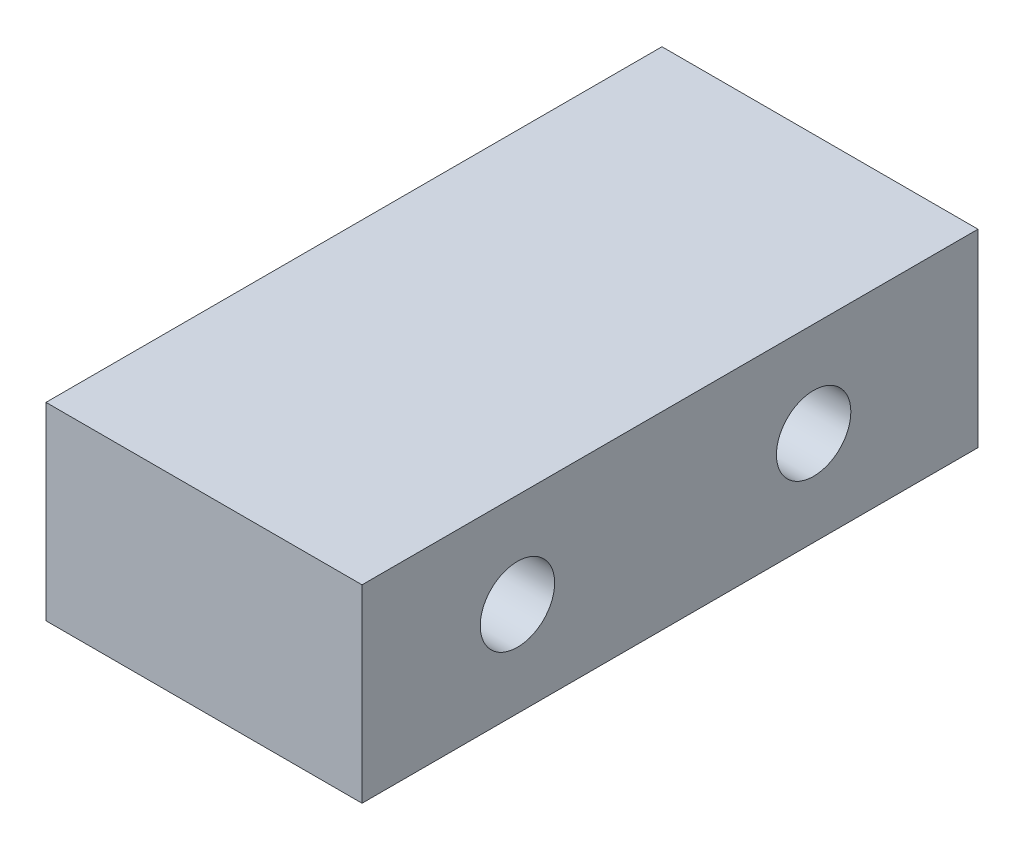
ISO-10303-21;
HEADER;
FILE_DESCRIPTION(('STEP AP214'),'2;1');
FILE_NAME('part.step','',(''),(''),'','','');
FILE_SCHEMA(('AUTOMOTIVE_DESIGN { 1 0 10303 214 1 1 1 1 }'));
ENDSEC;
DATA;
#1=APPLICATION_CONTEXT('core data for automotive mechanical design processes');
#2=APPLICATION_PROTOCOL_DEFINITION('international standard','automotive_design',2000,#1);
#3=PRODUCT_CONTEXT('',#1,'mechanical');
#4=PRODUCT('Part','Part','',(#3));
#5=PRODUCT_RELATED_PRODUCT_CATEGORY('part','',(#4));
#6=PRODUCT_DEFINITION_FORMATION('','',#4);
#7=PRODUCT_DEFINITION_CONTEXT('part definition',#1,'design');
#8=PRODUCT_DEFINITION('design','',#6,#7);
#9=PRODUCT_DEFINITION_SHAPE('','',#8);
#10=(LENGTH_UNIT() NAMED_UNIT(*) SI_UNIT(.MILLI.,.METRE.));
#11=(NAMED_UNIT(*) PLANE_ANGLE_UNIT() SI_UNIT($,.RADIAN.));
#12=(NAMED_UNIT(*) SI_UNIT($,.STERADIAN.) SOLID_ANGLE_UNIT());
#13=UNCERTAINTY_MEASURE_WITH_UNIT(LENGTH_MEASURE(1.E-05),#10,'distance_accuracy_value','');
#14=(GEOMETRIC_REPRESENTATION_CONTEXT(3) GLOBAL_UNCERTAINTY_ASSIGNED_CONTEXT((#13)) GLOBAL_UNIT_ASSIGNED_CONTEXT((#10,
#11,#12)) REPRESENTATION_CONTEXT('',''));
#15=CARTESIAN_POINT('',(0.,0.,0.));
#16=DIRECTION('',(0.,0.,1.));
#17=DIRECTION('',(1.,0.,0.));
#18=AXIS2_PLACEMENT_3D('',#15,#16,#17);
#19=CARTESIAN_POINT('',(5.095,6.1,9.93));
#20=DIRECTION('',(-1.,0.,0.));
#21=DIRECTION('',(0.,0.,1.));
#22=AXIS2_PLACEMENT_3D('',#19,#20,#21);
#23=PLANE('',#22);
#24=CARTESIAN_POINT('',(5.095,3.05,4.92));
#25=DIRECTION('',(1.,0.,0.));
#26=DIRECTION('',(0.,0.,-1.));
#27=AXIS2_PLACEMENT_3D('',#24,#25,#26);
#28=CIRCLE('',#27,1.2);
#29=CARTESIAN_POINT('',(5.095,3.05,3.72));
#30=VERTEX_POINT('',#29);
#31=EDGE_CURVE('E115',#30,#30,#28,.T.);
#32=ORIENTED_EDGE('',*,*,#31,.F.);
#33=EDGE_LOOP('',(#32));
#34=FACE_BOUND('',#33,.T.);
#35=CARTESIAN_POINT('',(5.095,3.05,-4.63));
#36=DIRECTION('',(1.,0.,0.));
#37=DIRECTION('',(0.,0.,-1.));
#38=AXIS2_PLACEMENT_3D('',#35,#36,#37);
#39=CIRCLE('',#38,1.2);
#40=CARTESIAN_POINT('',(5.095,3.05,-5.83000000000001));
#41=VERTEX_POINT('',#40);
#42=EDGE_CURVE('E109',#41,#41,#39,.T.);
#43=ORIENTED_EDGE('',*,*,#42,.F.);
#44=EDGE_LOOP('',(#43));
#45=FACE_BOUND('',#44,.T.);
#46=DIRECTION('',(0.,0.,-1.));
#47=VECTOR('',#46,1.);
#48=CARTESIAN_POINT('',(5.095,0.,9.93));
#49=LINE('',#48,#47);
#50=CARTESIAN_POINT('',(5.095,0.,9.93));
#51=VERTEX_POINT('',#50);
#52=CARTESIAN_POINT('',(5.095,0.,-9.93000000000001));
#53=VERTEX_POINT('',#52);
#54=EDGE_CURVE('E95',#51,#53,#49,.T.);
#55=ORIENTED_EDGE('',*,*,#54,.T.);
#56=DIRECTION('',(0.,-1.,0.));
#57=VECTOR('',#56,1.);
#58=CARTESIAN_POINT('',(5.095,6.1,-9.93000000000001));
#59=LINE('',#58,#57);
#60=CARTESIAN_POINT('',(5.095,6.1,-9.93000000000001));
#61=VERTEX_POINT('',#60);
#62=EDGE_CURVE('E11',#61,#53,#59,.T.);
#63=ORIENTED_EDGE('',*,*,#62,.F.);
#64=DIRECTION('',(0.,0.,-1.));
#65=VECTOR('',#64,1.);
#66=CARTESIAN_POINT('',(5.095,6.1,9.93));
#67=LINE('',#66,#65);
#68=CARTESIAN_POINT('',(5.095,6.1,9.93));
#69=VERTEX_POINT('',#68);
#70=EDGE_CURVE('E83',#69,#61,#67,.T.);
#71=ORIENTED_EDGE('',*,*,#70,.F.);
#72=DIRECTION('',(0.,-1.,0.));
#73=VECTOR('',#72,1.);
#74=CARTESIAN_POINT('',(5.095,6.1,9.93));
#75=LINE('',#74,#73);
#76=EDGE_CURVE('E91',#69,#51,#75,.T.);
#77=ORIENTED_EDGE('',*,*,#76,.T.);
#78=EDGE_LOOP('',(#55,#63,#71,#77));
#79=FACE_BOUND('',#78,.T.);
#80=ADVANCED_FACE('F32',(#34,#45,#79),#23,.F.);
#81=CARTESIAN_POINT('',(-5.095,6.1,-9.93000000000001));
#82=DIRECTION('',(0.,0.,1.));
#83=DIRECTION('',(1.,0.,0.));
#84=AXIS2_PLACEMENT_3D('',#81,#82,#83);
#85=PLANE('',#84);
#86=DIRECTION('',(-1.,0.,0.));
#87=VECTOR('',#86,1.);
#88=CARTESIAN_POINT('',(-5.095,0.,-9.93000000000001));
#89=LINE('',#88,#87);
#90=CARTESIAN_POINT('',(-5.095,0.,-9.93000000000001));
#91=VERTEX_POINT('',#90);
#92=EDGE_CURVE('E87',#53,#91,#89,.T.);
#93=ORIENTED_EDGE('',*,*,#92,.T.);
#94=DIRECTION('',(0.,-1.,0.));
#95=VECTOR('',#94,1.);
#96=CARTESIAN_POINT('',(-5.095,6.1,-9.93000000000001));
#97=LINE('',#96,#95);
#98=CARTESIAN_POINT('',(-5.095,6.1,-9.93000000000001));
#99=VERTEX_POINT('',#98);
#100=EDGE_CURVE('E40',#99,#91,#97,.T.);
#101=ORIENTED_EDGE('',*,*,#100,.F.);
#102=DIRECTION('',(-1.,0.,0.));
#103=VECTOR('',#102,1.);
#104=CARTESIAN_POINT('',(-5.095,6.1,-9.93000000000001));
#105=LINE('',#104,#103);
#106=EDGE_CURVE('E78',#61,#99,#105,.T.);
#107=ORIENTED_EDGE('',*,*,#106,.F.);
#108=ORIENTED_EDGE('',*,*,#62,.T.);
#109=EDGE_LOOP('',(#93,#101,#107,#108));
#110=FACE_BOUND('',#109,.T.);
#111=ADVANCED_FACE('F86',(#110),#85,.F.);
#112=CARTESIAN_POINT('',(-5.095,6.1,9.93));
#113=DIRECTION('',(1.,0.,0.));
#114=DIRECTION('',(0.,0.,-1.));
#115=AXIS2_PLACEMENT_3D('',#112,#113,#114);
#116=PLANE('',#115);
#117=CARTESIAN_POINT('',(-5.095,3.05,4.92));
#118=DIRECTION('',(1.,0.,0.));
#119=DIRECTION('',(0.,0.,-1.));
#120=AXIS2_PLACEMENT_3D('',#117,#118,#119);
#121=CIRCLE('',#120,1.2);
#122=CARTESIAN_POINT('',(-5.095,3.05,3.72));
#123=VERTEX_POINT('',#122);
#124=EDGE_CURVE('E112',#123,#123,#121,.T.);
#125=ORIENTED_EDGE('',*,*,#124,.T.);
#126=EDGE_LOOP('',(#125));
#127=FACE_BOUND('',#126,.T.);
#128=CARTESIAN_POINT('',(-5.095,3.05,-4.63));
#129=DIRECTION('',(1.,0.,0.));
#130=DIRECTION('',(0.,0.,-1.));
#131=AXIS2_PLACEMENT_3D('',#128,#129,#130);
#132=CIRCLE('',#131,1.2);
#133=CARTESIAN_POINT('',(-5.095,3.05,-5.83000000000001));
#134=VERTEX_POINT('',#133);
#135=EDGE_CURVE('E98',#134,#134,#132,.T.);
#136=ORIENTED_EDGE('',*,*,#135,.T.);
#137=EDGE_LOOP('',(#136));
#138=FACE_BOUND('',#137,.T.);
#139=DIRECTION('',(0.,0.,1.));
#140=VECTOR('',#139,1.);
#141=CARTESIAN_POINT('',(-5.095,0.,9.93));
#142=LINE('',#141,#140);
#143=CARTESIAN_POINT('',(-5.095,0.,9.93));
#144=VERTEX_POINT('',#143);
#145=EDGE_CURVE('E65',#91,#144,#142,.T.);
#146=ORIENTED_EDGE('',*,*,#145,.T.);
#147=DIRECTION('',(0.,-1.,0.));
#148=VECTOR('',#147,1.);
#149=CARTESIAN_POINT('',(-5.095,6.1,9.93));
#150=LINE('',#149,#148);
#151=CARTESIAN_POINT('',(-5.095,6.1,9.93));
#152=VERTEX_POINT('',#151);
#153=EDGE_CURVE('E88',#152,#144,#150,.T.);
#154=ORIENTED_EDGE('',*,*,#153,.F.);
#155=DIRECTION('',(0.,0.,1.));
#156=VECTOR('',#155,1.);
#157=CARTESIAN_POINT('',(-5.095,6.1,9.93));
#158=LINE('',#157,#156);
#159=EDGE_CURVE('E81',#99,#152,#158,.T.);
#160=ORIENTED_EDGE('',*,*,#159,.F.);
#161=ORIENTED_EDGE('',*,*,#100,.T.);
#162=EDGE_LOOP('',(#146,#154,#160,#161));
#163=FACE_BOUND('',#162,.T.);
#164=ADVANCED_FACE('F89',(#127,#138,#163),#116,.F.);
#165=CARTESIAN_POINT('',(-5.095,6.1,9.93));
#166=DIRECTION('',(0.,0.,-1.));
#167=DIRECTION('',(-1.,0.,0.));
#168=AXIS2_PLACEMENT_3D('',#165,#166,#167);
#169=PLANE('',#168);
#170=DIRECTION('',(1.,0.,0.));
#171=VECTOR('',#170,1.);
#172=CARTESIAN_POINT('',(-5.095,0.,9.93));
#173=LINE('',#172,#171);
#174=EDGE_CURVE('E71',#144,#51,#173,.T.);
#175=ORIENTED_EDGE('',*,*,#174,.T.);
#176=ORIENTED_EDGE('',*,*,#76,.F.);
#177=DIRECTION('',(1.,0.,0.));
#178=VECTOR('',#177,1.);
#179=CARTESIAN_POINT('',(-5.095,6.1,9.93));
#180=LINE('',#179,#178);
#181=EDGE_CURVE('E48',#152,#69,#180,.T.);
#182=ORIENTED_EDGE('',*,*,#181,.F.);
#183=ORIENTED_EDGE('',*,*,#153,.T.);
#184=EDGE_LOOP('',(#175,#176,#182,#183));
#185=FACE_BOUND('',#184,.T.);
#186=ADVANCED_FACE('F103',(#185),#169,.F.);
#187=CARTESIAN_POINT('',(0.,6.1,0.));
#188=DIRECTION('',(0.,-1.,0.));
#189=DIRECTION('',(0.,0.,-1.));
#190=AXIS2_PLACEMENT_3D('',#187,#188,#189);
#191=PLANE('',#190);
#192=ORIENTED_EDGE('',*,*,#70,.T.);
#193=ORIENTED_EDGE('',*,*,#106,.T.);
#194=ORIENTED_EDGE('',*,*,#159,.T.);
#195=ORIENTED_EDGE('',*,*,#181,.T.);
#196=EDGE_LOOP('',(#192,#193,#194,#195));
#197=FACE_BOUND('',#196,.T.);
#198=ADVANCED_FACE('F79',(#197),#191,.F.);
#199=CARTESIAN_POINT('',(0.,0.,0.));
#200=DIRECTION('',(0.,-1.,0.));
#201=DIRECTION('',(0.,0.,-1.));
#202=AXIS2_PLACEMENT_3D('',#199,#200,#201);
#203=PLANE('',#202);
#204=ORIENTED_EDGE('',*,*,#54,.F.);
#205=ORIENTED_EDGE('',*,*,#174,.F.);
#206=ORIENTED_EDGE('',*,*,#145,.F.);
#207=ORIENTED_EDGE('',*,*,#92,.F.);
#208=EDGE_LOOP('',(#204,#205,#206,#207));
#209=FACE_BOUND('',#208,.T.);
#210=ADVANCED_FACE('F106',(#209),#203,.T.);
#211=CARTESIAN_POINT('',(-5.095,3.05,-4.63));
#212=DIRECTION('',(1.,0.,0.));
#213=DIRECTION('',(0.,0.,-1.));
#214=AXIS2_PLACEMENT_3D('',#211,#212,#213);
#215=CYLINDRICAL_SURFACE('',#214,1.2);
#216=CARTESIAN_POINT('',(-5.095,3.05,-5.83000000000001));
#217=CARTESIAN_POINT('',(-4.98885416666667,3.05,-5.83000000000001));
#218=CARTESIAN_POINT('',(-4.88270833333333,3.05,-5.83000000000001));
#219=CARTESIAN_POINT('',(-4.67041666666667,3.05,-5.83000000000001));
#220=CARTESIAN_POINT('',(-4.56427083333333,3.05,-5.83000000000001));
#221=CARTESIAN_POINT('',(-4.35197916666667,3.05,-5.83000000000001));
#222=CARTESIAN_POINT('',(-4.24583333333333,3.05,-5.83000000000001));
#223=CARTESIAN_POINT('',(-4.03354166666667,3.05,-5.83000000000001));
#224=CARTESIAN_POINT('',(-3.92739583333333,3.05,-5.83000000000001));
#225=CARTESIAN_POINT('',(-3.71510416666666,3.05,-5.83000000000001));
#226=CARTESIAN_POINT('',(-3.60895833333333,3.05,-5.83000000000001));
#227=CARTESIAN_POINT('',(-3.39666666666667,3.05,-5.83000000000001));
#228=CARTESIAN_POINT('',(-3.29052083333333,3.05,-5.83000000000001));
#229=CARTESIAN_POINT('',(-3.07822916666667,3.05,-5.83000000000001));
#230=CARTESIAN_POINT('',(-2.97208333333333,3.05,-5.83000000000001));
#231=CARTESIAN_POINT('',(-2.75979166666667,3.05,-5.83000000000001));
#232=CARTESIAN_POINT('',(-2.65364583333333,3.05,-5.83000000000001));
#233=CARTESIAN_POINT('',(-2.44135416666666,3.05,-5.83000000000001));
#234=CARTESIAN_POINT('',(-2.33520833333333,3.05,-5.83000000000001));
#235=CARTESIAN_POINT('',(-2.12291666666667,3.05,-5.83000000000001));
#236=CARTESIAN_POINT('',(-2.01677083333333,3.05,-5.83000000000001));
#237=CARTESIAN_POINT('',(-1.80447916666666,3.05,-5.83000000000001));
#238=CARTESIAN_POINT('',(-1.69833333333333,3.05,-5.83000000000001));
#239=CARTESIAN_POINT('',(-1.48604166666667,3.05,-5.83000000000001));
#240=CARTESIAN_POINT('',(-1.37989583333333,3.05,-5.83000000000001));
#241=CARTESIAN_POINT('',(-1.16760416666667,3.05,-5.83000000000001));
#242=CARTESIAN_POINT('',(-1.06145833333333,3.05,-5.83000000000001));
#243=CARTESIAN_POINT('',(-0.849166666666666,3.05,-5.83000000000001));
#244=CARTESIAN_POINT('',(-0.743020833333333,3.05,-5.83000000000001));
#245=CARTESIAN_POINT('',(-0.530729166666666,3.05,-5.83000000000001));
#246=CARTESIAN_POINT('',(-0.424583333333333,3.05,-5.83000000000001));
#247=CARTESIAN_POINT('',(-0.212291666666666,3.05,-5.83000000000001));
#248=CARTESIAN_POINT('',(-0.106145833333333,3.05,-5.83000000000001));
#249=CARTESIAN_POINT('',(0.106145833333334,3.05,-5.83000000000001));
#250=CARTESIAN_POINT('',(0.212291666666668,3.05,-5.83000000000001));
#251=CARTESIAN_POINT('',(0.424583333333334,3.05,-5.83000000000001));
#252=CARTESIAN_POINT('',(0.530729166666668,3.05,-5.83000000000001));
#253=CARTESIAN_POINT('',(0.743020833333335,3.05,-5.83000000000001));
#254=CARTESIAN_POINT('',(0.849166666666668,3.05,-5.83000000000001));
#255=CARTESIAN_POINT('',(1.06145833333333,3.05,-5.83000000000001));
#256=CARTESIAN_POINT('',(1.16760416666667,3.05,-5.83000000000001));
#257=CARTESIAN_POINT('',(1.37989583333333,3.05,-5.83000000000001));
#258=CARTESIAN_POINT('',(1.48604166666667,3.05,-5.83000000000001));
#259=CARTESIAN_POINT('',(1.69833333333333,3.05,-5.83000000000001));
#260=CARTESIAN_POINT('',(1.80447916666667,3.05,-5.83000000000001));
#261=CARTESIAN_POINT('',(2.01677083333333,3.05,-5.83000000000001));
#262=CARTESIAN_POINT('',(2.12291666666667,3.05,-5.83000000000001));
#263=CARTESIAN_POINT('',(2.33520833333333,3.05,-5.83000000000001));
#264=CARTESIAN_POINT('',(2.44135416666667,3.05,-5.83000000000001));
#265=CARTESIAN_POINT('',(2.65364583333333,3.05,-5.83000000000001));
#266=CARTESIAN_POINT('',(2.75979166666667,3.05,-5.83000000000001));
#267=CARTESIAN_POINT('',(2.97208333333333,3.05,-5.83000000000001));
#268=CARTESIAN_POINT('',(3.07822916666667,3.05,-5.83000000000001));
#269=CARTESIAN_POINT('',(3.29052083333333,3.05,-5.83000000000001));
#270=CARTESIAN_POINT('',(3.39666666666667,3.05,-5.83000000000001));
#271=CARTESIAN_POINT('',(3.60895833333333,3.05,-5.83000000000001));
#272=CARTESIAN_POINT('',(3.71510416666667,3.05,-5.83000000000001));
#273=CARTESIAN_POINT('',(3.92739583333333,3.05,-5.83000000000001));
#274=CARTESIAN_POINT('',(4.03354166666667,3.05,-5.83000000000001));
#275=CARTESIAN_POINT('',(4.24583333333334,3.05,-5.83000000000001));
#276=CARTESIAN_POINT('',(4.35197916666667,3.05,-5.83000000000001));
#277=CARTESIAN_POINT('',(4.56427083333334,3.05,-5.83000000000001));
#278=CARTESIAN_POINT('',(4.67041666666667,3.05,-5.83000000000001));
#279=CARTESIAN_POINT('',(4.88270833333334,3.05,-5.83000000000001));
#280=CARTESIAN_POINT('',(4.98885416666667,3.05,-5.83000000000001));
#281=CARTESIAN_POINT('',(5.095,3.05,-5.83000000000001));
#282=B_SPLINE_CURVE_WITH_KNOTS('',3,(#216,#217,#218,#219,#220,#221,#222,#223,#224,#225,#226,
#227,#228,#229,#230,#231,#232,#233,#234,#235,#236,#237,#238,#239,#240,#241,#242,#243,#244,#245,
#246,#247,#248,#249,#250,#251,#252,#253,#254,#255,#256,#257,#258,#259,#260,#261,#262,#263,#264,
#265,#266,#267,#268,#269,#270,#271,#272,#273,#274,#275,#276,#277,#278,#279,#280,#281),
.UNSPECIFIED.,.F.,.F.,(4,2,2,2,2,2,2,2,2,2,2,2,2,2,2,2,2,2,2,2,2,2,2,2,2,2,2,2,2,2,2,2,4),(0.,
0.3184375,0.636875,0.9553125,1.27375,1.5921875,1.910625,2.2290625,2.5475,2.8659375,3.184375,
3.5028125,3.82125,4.1396875,4.458125,4.7765625,5.095,5.4134375,5.731875,6.0503125,6.36875,
6.6871875,7.005625,7.3240625,7.6425,7.9609375,8.279375,8.5978125,8.91625,9.2346875,9.553125,
9.8715625,10.19),.UNSPECIFIED.);
#283=EDGE_CURVE('BSEAM126',#134,#41,#282,.T.);
#284=ORIENTED_EDGE('',*,*,#135,.F.);
#285=ORIENTED_EDGE('',*,*,#42,.T.);
#286=ORIENTED_EDGE('',*,*,#283,.T.);
#287=ORIENTED_EDGE('',*,*,#283,.F.);
#288=EDGE_LOOP('',(#284,#286,#285,#287));
#289=FACE_BOUND('',#288,.T.);
#290=ADVANCED_FACE('F126',(#289),#215,.F.);
#291=CARTESIAN_POINT('',(-5.095,3.05,4.92));
#292=DIRECTION('',(1.,0.,0.));
#293=DIRECTION('',(0.,0.,-1.));
#294=AXIS2_PLACEMENT_3D('',#291,#292,#293);
#295=CYLINDRICAL_SURFACE('',#294,1.2);
#296=CARTESIAN_POINT('',(-5.095,3.05,3.72));
#297=CARTESIAN_POINT('',(-4.98885416666667,3.05,3.72));
#298=CARTESIAN_POINT('',(-4.88270833333333,3.05,3.72));
#299=CARTESIAN_POINT('',(-4.67041666666667,3.05,3.72));
#300=CARTESIAN_POINT('',(-4.56427083333333,3.05,3.72));
#301=CARTESIAN_POINT('',(-4.35197916666667,3.05,3.72));
#302=CARTESIAN_POINT('',(-4.24583333333333,3.05,3.72));
#303=CARTESIAN_POINT('',(-4.03354166666667,3.05,3.72));
#304=CARTESIAN_POINT('',(-3.92739583333333,3.05,3.72));
#305=CARTESIAN_POINT('',(-3.71510416666666,3.05,3.72));
#306=CARTESIAN_POINT('',(-3.60895833333333,3.05,3.72));
#307=CARTESIAN_POINT('',(-3.39666666666667,3.05,3.72));
#308=CARTESIAN_POINT('',(-3.29052083333333,3.05,3.72));
#309=CARTESIAN_POINT('',(-3.07822916666667,3.05,3.72));
#310=CARTESIAN_POINT('',(-2.97208333333333,3.05,3.72));
#311=CARTESIAN_POINT('',(-2.75979166666667,3.05,3.72));
#312=CARTESIAN_POINT('',(-2.65364583333333,3.05,3.72));
#313=CARTESIAN_POINT('',(-2.44135416666666,3.05,3.72));
#314=CARTESIAN_POINT('',(-2.33520833333333,3.05,3.72));
#315=CARTESIAN_POINT('',(-2.12291666666667,3.05,3.72));
#316=CARTESIAN_POINT('',(-2.01677083333333,3.05,3.72));
#317=CARTESIAN_POINT('',(-1.80447916666666,3.05,3.72));
#318=CARTESIAN_POINT('',(-1.69833333333333,3.05,3.72));
#319=CARTESIAN_POINT('',(-1.48604166666667,3.05,3.72));
#320=CARTESIAN_POINT('',(-1.37989583333333,3.05,3.72));
#321=CARTESIAN_POINT('',(-1.16760416666667,3.05,3.72));
#322=CARTESIAN_POINT('',(-1.06145833333333,3.05,3.72));
#323=CARTESIAN_POINT('',(-0.849166666666666,3.05,3.72));
#324=CARTESIAN_POINT('',(-0.743020833333333,3.05,3.72));
#325=CARTESIAN_POINT('',(-0.530729166666666,3.05,3.72));
#326=CARTESIAN_POINT('',(-0.424583333333333,3.05,3.72));
#327=CARTESIAN_POINT('',(-0.212291666666666,3.05,3.72));
#328=CARTESIAN_POINT('',(-0.106145833333333,3.05,3.72));
#329=CARTESIAN_POINT('',(0.106145833333334,3.05,3.72));
#330=CARTESIAN_POINT('',(0.212291666666668,3.05,3.72));
#331=CARTESIAN_POINT('',(0.424583333333334,3.05,3.72));
#332=CARTESIAN_POINT('',(0.530729166666668,3.05,3.72));
#333=CARTESIAN_POINT('',(0.743020833333335,3.05,3.72));
#334=CARTESIAN_POINT('',(0.849166666666668,3.05,3.72));
#335=CARTESIAN_POINT('',(1.06145833333333,3.05,3.72));
#336=CARTESIAN_POINT('',(1.16760416666667,3.05,3.72));
#337=CARTESIAN_POINT('',(1.37989583333333,3.05,3.72));
#338=CARTESIAN_POINT('',(1.48604166666667,3.05,3.72));
#339=CARTESIAN_POINT('',(1.69833333333333,3.05,3.72));
#340=CARTESIAN_POINT('',(1.80447916666667,3.05,3.72));
#341=CARTESIAN_POINT('',(2.01677083333333,3.05,3.72));
#342=CARTESIAN_POINT('',(2.12291666666667,3.05,3.72));
#343=CARTESIAN_POINT('',(2.33520833333333,3.05,3.72));
#344=CARTESIAN_POINT('',(2.44135416666667,3.05,3.72));
#345=CARTESIAN_POINT('',(2.65364583333333,3.05,3.72));
#346=CARTESIAN_POINT('',(2.75979166666667,3.05,3.72));
#347=CARTESIAN_POINT('',(2.97208333333333,3.05,3.72));
#348=CARTESIAN_POINT('',(3.07822916666667,3.05,3.72));
#349=CARTESIAN_POINT('',(3.29052083333333,3.05,3.72));
#350=CARTESIAN_POINT('',(3.39666666666667,3.05,3.72));
#351=CARTESIAN_POINT('',(3.60895833333333,3.05,3.72));
#352=CARTESIAN_POINT('',(3.71510416666667,3.05,3.72));
#353=CARTESIAN_POINT('',(3.92739583333333,3.05,3.72));
#354=CARTESIAN_POINT('',(4.03354166666667,3.05,3.72));
#355=CARTESIAN_POINT('',(4.24583333333334,3.05,3.72));
#356=CARTESIAN_POINT('',(4.35197916666667,3.05,3.72));
#357=CARTESIAN_POINT('',(4.56427083333334,3.05,3.72));
#358=CARTESIAN_POINT('',(4.67041666666667,3.05,3.72));
#359=CARTESIAN_POINT('',(4.88270833333334,3.05,3.72));
#360=CARTESIAN_POINT('',(4.98885416666667,3.05,3.72));
#361=CARTESIAN_POINT('',(5.095,3.05,3.72));
#362=B_SPLINE_CURVE_WITH_KNOTS('',3,(#296,#297,#298,#299,#300,#301,#302,#303,#304,#305,#306,
#307,#308,#309,#310,#311,#312,#313,#314,#315,#316,#317,#318,#319,#320,#321,#322,#323,#324,#325,
#326,#327,#328,#329,#330,#331,#332,#333,#334,#335,#336,#337,#338,#339,#340,#341,#342,#343,#344,
#345,#346,#347,#348,#349,#350,#351,#352,#353,#354,#355,#356,#357,#358,#359,#360,#361),
.UNSPECIFIED.,.F.,.F.,(4,2,2,2,2,2,2,2,2,2,2,2,2,2,2,2,2,2,2,2,2,2,2,2,2,2,2,2,2,2,2,2,4),(0.,
0.3184375,0.636875,0.9553125,1.27375,1.5921875,1.910625,2.2290625,2.5475,2.8659375,3.184375,
3.5028125,3.82125,4.1396875,4.458125,4.7765625,5.095,5.4134375,5.731875,6.0503125,6.36875,
6.6871875,7.005625,7.3240625,7.6425,7.9609375,8.279375,8.5978125,8.91625,9.2346875,9.553125,
9.8715625,10.19),.UNSPECIFIED.);
#363=EDGE_CURVE('BSEAM123',#123,#30,#362,.T.);
#364=ORIENTED_EDGE('',*,*,#124,.F.);
#365=ORIENTED_EDGE('',*,*,#31,.T.);
#366=ORIENTED_EDGE('',*,*,#363,.T.);
#367=ORIENTED_EDGE('',*,*,#363,.F.);
#368=EDGE_LOOP('',(#364,#366,#365,#367));
#369=FACE_BOUND('',#368,.T.);
#370=ADVANCED_FACE('F123',(#369),#295,.F.);
#371=CLOSED_SHELL('',(#80,#111,#164,#186,#198,#210,#290,#370));
#372=MANIFOLD_SOLID_BREP('B2',#371);
#373=ADVANCED_BREP_SHAPE_REPRESENTATION('',(#18,#372),#14);
#374=SHAPE_DEFINITION_REPRESENTATION(#9,#373);
ENDSEC;
END-ISO-10303-21;
